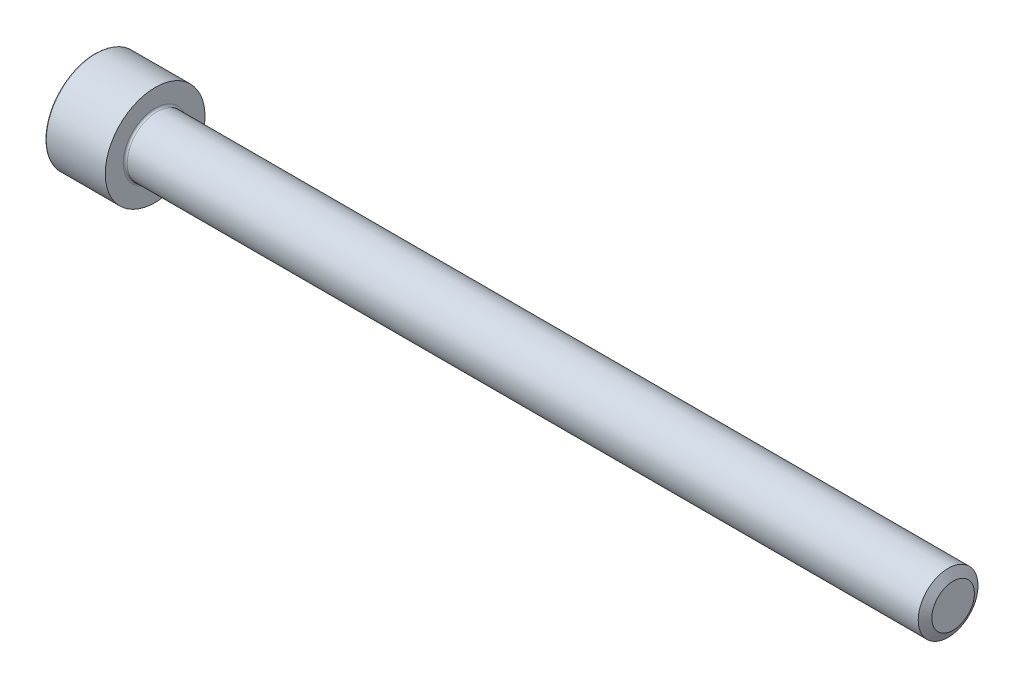
ISO-10303-21;
HEADER;
FILE_DESCRIPTION(('STEP AP214'),'2;1');
FILE_NAME('part.step','',(''),(''),'','','');
FILE_SCHEMA(('AUTOMOTIVE_DESIGN { 1 0 10303 214 1 1 1 1 }'));
ENDSEC;
DATA;
#1=APPLICATION_CONTEXT('core data for automotive mechanical design processes');
#2=APPLICATION_PROTOCOL_DEFINITION('international standard','automotive_design',2000,#1);
#3=PRODUCT_CONTEXT('',#1,'mechanical');
#4=PRODUCT('Part','Part','',(#3));
#5=PRODUCT_RELATED_PRODUCT_CATEGORY('part','',(#4));
#6=PRODUCT_DEFINITION_FORMATION('','',#4);
#7=PRODUCT_DEFINITION_CONTEXT('part definition',#1,'design');
#8=PRODUCT_DEFINITION('design','',#6,#7);
#9=PRODUCT_DEFINITION_SHAPE('','',#8);
#10=(LENGTH_UNIT() NAMED_UNIT(*) SI_UNIT(.MILLI.,.METRE.));
#11=(NAMED_UNIT(*) PLANE_ANGLE_UNIT() SI_UNIT($,.RADIAN.));
#12=(NAMED_UNIT(*) SI_UNIT($,.STERADIAN.) SOLID_ANGLE_UNIT());
#13=UNCERTAINTY_MEASURE_WITH_UNIT(LENGTH_MEASURE(1.E-05),#10,'distance_accuracy_value','');
#14=(GEOMETRIC_REPRESENTATION_CONTEXT(3) GLOBAL_UNCERTAINTY_ASSIGNED_CONTEXT((#13)) GLOBAL_UNIT_ASSIGNED_CONTEXT((#10,
#11,#12)) REPRESENTATION_CONTEXT('',''));
#15=CARTESIAN_POINT('',(0.,0.,0.));
#16=DIRECTION('',(0.,0.,1.));
#17=DIRECTION('',(1.,0.,0.));
#18=AXIS2_PLACEMENT_3D('',#15,#16,#17);
#19=CARTESIAN_POINT('',(0.,0.,0.));
#20=DIRECTION('',(-1.,0.,0.));
#21=DIRECTION('',(0.,0.,1.));
#22=AXIS2_PLACEMENT_3D('',#19,#20,#21);
#23=CYLINDRICAL_SURFACE('',#22,3.);
#24=CARTESIAN_POINT('',(6.2,0.,0.));
#25=DIRECTION('',(-1.,0.,0.));
#26=DIRECTION('',(0.,0.,1.));
#27=AXIS2_PLACEMENT_3D('',#24,#25,#26);
#28=CIRCLE('',#27,3.);
#29=CARTESIAN_POINT('',(6.2,0.,3.));
#30=VERTEX_POINT('',#29);
#31=EDGE_CURVE('E143',#30,#30,#28,.T.);
#32=ORIENTED_EDGE('',*,*,#31,.F.);
#33=EDGE_LOOP('',(#32));
#34=FACE_BOUND('',#33,.T.);
#35=CARTESIAN_POINT('',(85.5000146668818,0.,0.));
#36=DIRECTION('',(-1.,0.,0.));
#37=DIRECTION('',(0.,0.,1.));
#38=AXIS2_PLACEMENT_3D('',#35,#36,#37);
#39=CIRCLE('',#38,3.);
#40=CARTESIAN_POINT('',(85.5000146668818,0.,3.));
#41=VERTEX_POINT('',#40);
#42=EDGE_CURVE('E280',#41,#41,#39,.T.);
#43=ORIENTED_EDGE('',*,*,#42,.T.);
#44=EDGE_LOOP('',(#43));
#45=FACE_BOUND('',#44,.T.);
#46=ADVANCED_FACE('F40',(#34,#45),#23,.T.);
#47=CARTESIAN_POINT('',(0.,0.,0.));
#48=DIRECTION('',(1.,0.,0.));
#49=DIRECTION('',(0.,0.,-1.));
#50=AXIS2_PLACEMENT_3D('',#47,#48,#49);
#51=PLANE('',#50);
#52=CARTESIAN_POINT('',(0.,0.,0.));
#53=DIRECTION('',(1.,0.,0.));
#54=DIRECTION('',(0.,0.,-1.));
#55=AXIS2_PLACEMENT_3D('',#52,#53,#54);
#56=CIRCLE('',#55,4.9);
#57=CARTESIAN_POINT('',(0.,0.,-4.9));
#58=VERTEX_POINT('',#57);
#59=EDGE_CURVE('E48',#58,#58,#56,.F.);
#60=ORIENTED_EDGE('',*,*,#59,.T.);
#61=EDGE_LOOP('',(#60));
#62=FACE_BOUND('',#61,.T.);
#63=DIRECTION('',(0.,0.866025403784439,-0.5));
#64=VECTOR('',#63,1.);
#65=CARTESIAN_POINT('',(0.,0.,2.86));
#66=LINE('',#65,#64);
#67=CARTESIAN_POINT('',(0.,0.,2.86));
#68=VERTEX_POINT('',#67);
#69=CARTESIAN_POINT('',(0.,2.47683265482349,1.43));
#70=VERTEX_POINT('',#69);
#71=EDGE_CURVE('E129',#68,#70,#66,.T.);
#72=ORIENTED_EDGE('',*,*,#71,.F.);
#73=DIRECTION('',(0.,0.866025403784439,0.5));
#74=VECTOR('',#73,1.);
#75=CARTESIAN_POINT('',(0.,-2.47683265482349,1.43));
#76=LINE('',#75,#74);
#77=CARTESIAN_POINT('',(0.,-2.47683265482349,1.43));
#78=VERTEX_POINT('',#77);
#79=EDGE_CURVE('E55',#78,#68,#76,.T.);
#80=ORIENTED_EDGE('',*,*,#79,.F.);
#81=DIRECTION('',(0.,0.,1.));
#82=VECTOR('',#81,1.);
#83=CARTESIAN_POINT('',(0.,-2.47683265482349,-1.43));
#84=LINE('',#83,#82);
#85=CARTESIAN_POINT('',(0.,-2.47683265482349,-1.43));
#86=VERTEX_POINT('',#85);
#87=EDGE_CURVE('E139',#86,#78,#84,.T.);
#88=ORIENTED_EDGE('',*,*,#87,.F.);
#89=DIRECTION('',(0.,-0.866025403784439,0.5));
#90=VECTOR('',#89,1.);
#91=CARTESIAN_POINT('',(0.,0.,-2.86));
#92=LINE('',#91,#90);
#93=CARTESIAN_POINT('',(0.,0.,-2.86));
#94=VERTEX_POINT('',#93);
#95=EDGE_CURVE('E137',#94,#86,#92,.T.);
#96=ORIENTED_EDGE('',*,*,#95,.F.);
#97=DIRECTION('',(0.,-0.866025403784439,-0.5));
#98=VECTOR('',#97,1.);
#99=CARTESIAN_POINT('',(0.,2.47683265482349,-1.43));
#100=LINE('',#99,#98);
#101=CARTESIAN_POINT('',(0.,2.47683265482349,-1.43));
#102=VERTEX_POINT('',#101);
#103=EDGE_CURVE('E103',#102,#94,#100,.T.);
#104=ORIENTED_EDGE('',*,*,#103,.F.);
#105=DIRECTION('',(0.,0.,-1.));
#106=VECTOR('',#105,1.);
#107=CARTESIAN_POINT('',(0.,2.47683265482349,1.43));
#108=LINE('',#107,#106);
#109=EDGE_CURVE('E133',#70,#102,#108,.T.);
#110=ORIENTED_EDGE('',*,*,#109,.F.);
#111=EDGE_LOOP('',(#72,#80,#88,#96,#104,#110));
#112=FACE_BOUND('',#111,.T.);
#113=ADVANCED_FACE('F160',(#62,#112),#51,.F.);
#114=CARTESIAN_POINT('',(0.,0.,0.));
#115=DIRECTION('',(-1.,0.,0.));
#116=DIRECTION('',(0.,0.,1.));
#117=AXIS2_PLACEMENT_3D('',#114,#115,#116);
#118=CYLINDRICAL_SURFACE('',#117,5.);
#119=CARTESIAN_POINT('',(0.1,0.,0.));
#120=DIRECTION('',(1.,0.,0.));
#121=DIRECTION('',(0.,0.,-1.));
#122=AXIS2_PLACEMENT_3D('',#119,#120,#121);
#123=CIRCLE('',#122,5.);
#124=CARTESIAN_POINT('',(0.1,0.,-5.));
#125=VERTEX_POINT('',#124);
#126=EDGE_CURVE('E11',#125,#125,#123,.T.);
#127=ORIENTED_EDGE('',*,*,#126,.T.);
#128=EDGE_LOOP('',(#127));
#129=FACE_BOUND('',#128,.T.);
#130=CARTESIAN_POINT('',(6.,0.,0.));
#131=DIRECTION('',(-1.,0.,0.));
#132=DIRECTION('',(0.,0.,1.));
#133=AXIS2_PLACEMENT_3D('',#130,#131,#132);
#134=CIRCLE('',#133,5.);
#135=CARTESIAN_POINT('',(6.,0.,5.));
#136=VERTEX_POINT('',#135);
#137=EDGE_CURVE('E154',#136,#136,#134,.T.);
#138=ORIENTED_EDGE('',*,*,#137,.T.);
#139=EDGE_LOOP('',(#138));
#140=FACE_BOUND('',#139,.T.);
#141=ADVANCED_FACE('F179',(#129,#140),#118,.T.);
#142=CARTESIAN_POINT('',(6.,5.,0.));
#143=DIRECTION('',(-1.,0.,0.));
#144=DIRECTION('',(0.,0.,1.));
#145=AXIS2_PLACEMENT_3D('',#142,#143,#144);
#146=PLANE('',#145);
#147=ORIENTED_EDGE('',*,*,#137,.F.);
#148=EDGE_LOOP('',(#147));
#149=FACE_BOUND('',#148,.T.);
#150=CARTESIAN_POINT('',(6.,0.,0.));
#151=DIRECTION('',(-1.,0.,0.));
#152=DIRECTION('',(0.,0.,1.));
#153=AXIS2_PLACEMENT_3D('',#150,#151,#152);
#154=CIRCLE('',#153,3.2);
#155=CARTESIAN_POINT('',(6.,0.,3.2));
#156=VERTEX_POINT('',#155);
#157=EDGE_CURVE('E151',#156,#156,#154,.T.);
#158=ORIENTED_EDGE('',*,*,#157,.T.);
#159=EDGE_LOOP('',(#158));
#160=FACE_BOUND('',#159,.T.);
#161=ADVANCED_FACE('F188',(#149,#160),#146,.F.);
#162=CARTESIAN_POINT('',(6.2,0.,0.));
#163=DIRECTION('',(-1.,0.,0.));
#164=DIRECTION('',(0.,0.,1.));
#165=AXIS2_PLACEMENT_3D('',#162,#163,#164);
#166=TOROIDAL_SURFACE('',#165,3.2,0.2);
#167=ORIENTED_EDGE('',*,*,#157,.F.);
#168=EDGE_LOOP('',(#167));
#169=FACE_BOUND('',#168,.T.);
#170=ORIENTED_EDGE('',*,*,#31,.T.);
#171=EDGE_LOOP('',(#170));
#172=FACE_BOUND('',#171,.T.);
#173=ADVANCED_FACE('F184',(#169,#172),#166,.F.);
#174=CARTESIAN_POINT('',(3.,-2.47683265482349,1.43));
#175=DIRECTION('',(0.,-0.5,0.866025403784439));
#176=DIRECTION('',(0.,-0.866025403784439,-0.5));
#177=AXIS2_PLACEMENT_3D('',#174,#175,#176);
#178=PLANE('',#177);
#179=ORIENTED_EDGE('',*,*,#79,.T.);
#180=DIRECTION('',(-1.,0.,0.));
#181=VECTOR('',#180,1.);
#182=CARTESIAN_POINT('',(3.,0.,2.86));
#183=LINE('',#182,#181);
#184=CARTESIAN_POINT('',(3.,0.,2.86));
#185=VERTEX_POINT('',#184);
#186=EDGE_CURVE('E85',#185,#68,#183,.T.);
#187=ORIENTED_EDGE('',*,*,#186,.F.);
#188=DIRECTION('',(0.,0.866025403784439,0.5));
#189=VECTOR('',#188,1.);
#190=CARTESIAN_POINT('',(3.,-2.47683265482349,1.43));
#191=LINE('',#190,#189);
#192=CARTESIAN_POINT('',(3.,-2.47683265482349,1.43));
#193=VERTEX_POINT('',#192);
#194=EDGE_CURVE('E141',#193,#185,#191,.T.);
#195=ORIENTED_EDGE('',*,*,#194,.F.);
#196=DIRECTION('',(-1.,0.,0.));
#197=VECTOR('',#196,1.);
#198=CARTESIAN_POINT('',(3.,-2.47683265482349,1.43));
#199=LINE('',#198,#197);
#200=EDGE_CURVE('E63',#193,#78,#199,.T.);
#201=ORIENTED_EDGE('',*,*,#200,.T.);
#202=EDGE_LOOP('',(#179,#187,#195,#201));
#203=FACE_BOUND('',#202,.T.);
#204=ADVANCED_FACE('F187',(#203),#178,.F.);
#205=CARTESIAN_POINT('',(3.,-2.47683265482349,-1.43));
#206=DIRECTION('',(0.,-1.,0.));
#207=DIRECTION('',(0.,0.,-1.));
#208=AXIS2_PLACEMENT_3D('',#205,#206,#207);
#209=PLANE('',#208);
#210=ORIENTED_EDGE('',*,*,#87,.T.);
#211=ORIENTED_EDGE('',*,*,#200,.F.);
#212=DIRECTION('',(0.,0.,1.));
#213=VECTOR('',#212,1.);
#214=CARTESIAN_POINT('',(3.,-2.47683265482349,-1.43));
#215=LINE('',#214,#213);
#216=CARTESIAN_POINT('',(3.,-2.47683265482349,-1.43));
#217=VERTEX_POINT('',#216);
#218=EDGE_CURVE('E115',#217,#193,#215,.T.);
#219=ORIENTED_EDGE('',*,*,#218,.F.);
#220=DIRECTION('',(-1.,0.,0.));
#221=VECTOR('',#220,1.);
#222=CARTESIAN_POINT('',(3.,-2.47683265482349,-1.43));
#223=LINE('',#222,#221);
#224=EDGE_CURVE('E107',#217,#86,#223,.T.);
#225=ORIENTED_EDGE('',*,*,#224,.T.);
#226=EDGE_LOOP('',(#210,#211,#219,#225));
#227=FACE_BOUND('',#226,.T.);
#228=ADVANCED_FACE('F218',(#227),#209,.F.);
#229=CARTESIAN_POINT('',(3.,0.,-2.86));
#230=DIRECTION('',(0.,-0.5,-0.866025403784438));
#231=DIRECTION('',(0.,0.866025403784439,-0.5));
#232=AXIS2_PLACEMENT_3D('',#229,#230,#231);
#233=PLANE('',#232);
#234=ORIENTED_EDGE('',*,*,#95,.T.);
#235=ORIENTED_EDGE('',*,*,#224,.F.);
#236=DIRECTION('',(0.,-0.866025403784439,0.5));
#237=VECTOR('',#236,1.);
#238=CARTESIAN_POINT('',(3.,0.,-2.86));
#239=LINE('',#238,#237);
#240=CARTESIAN_POINT('',(3.,0.,-2.86));
#241=VERTEX_POINT('',#240);
#242=EDGE_CURVE('E111',#241,#217,#239,.T.);
#243=ORIENTED_EDGE('',*,*,#242,.F.);
#244=DIRECTION('',(-1.,0.,0.));
#245=VECTOR('',#244,1.);
#246=CARTESIAN_POINT('',(3.,0.,-2.86));
#247=LINE('',#246,#245);
#248=EDGE_CURVE('E96',#241,#94,#247,.T.);
#249=ORIENTED_EDGE('',*,*,#248,.T.);
#250=EDGE_LOOP('',(#234,#235,#243,#249));
#251=FACE_BOUND('',#250,.T.);
#252=ADVANCED_FACE('F112',(#251),#233,.F.);
#253=CARTESIAN_POINT('',(3.,2.47683265482349,-1.43));
#254=DIRECTION('',(0.,0.5,-0.866025403784439));
#255=DIRECTION('',(0.,0.866025403784439,0.5));
#256=AXIS2_PLACEMENT_3D('',#253,#254,#255);
#257=PLANE('',#256);
#258=ORIENTED_EDGE('',*,*,#103,.T.);
#259=ORIENTED_EDGE('',*,*,#248,.F.);
#260=DIRECTION('',(0.,-0.866025403784439,-0.5));
#261=VECTOR('',#260,1.);
#262=CARTESIAN_POINT('',(3.,2.47683265482349,-1.43));
#263=LINE('',#262,#261);
#264=CARTESIAN_POINT('',(3.,2.47683265482349,-1.43));
#265=VERTEX_POINT('',#264);
#266=EDGE_CURVE('E100',#265,#241,#263,.T.);
#267=ORIENTED_EDGE('',*,*,#266,.F.);
#268=DIRECTION('',(-1.,0.,0.));
#269=VECTOR('',#268,1.);
#270=CARTESIAN_POINT('',(3.,2.47683265482349,-1.43));
#271=LINE('',#270,#269);
#272=EDGE_CURVE('E108',#265,#102,#271,.T.);
#273=ORIENTED_EDGE('',*,*,#272,.T.);
#274=EDGE_LOOP('',(#258,#259,#267,#273));
#275=FACE_BOUND('',#274,.T.);
#276=ADVANCED_FACE('F98',(#275),#257,.F.);
#277=CARTESIAN_POINT('',(3.,2.47683265482349,1.43));
#278=DIRECTION('',(0.,1.,0.));
#279=DIRECTION('',(0.,0.,1.));
#280=AXIS2_PLACEMENT_3D('',#277,#278,#279);
#281=PLANE('',#280);
#282=ORIENTED_EDGE('',*,*,#109,.T.);
#283=ORIENTED_EDGE('',*,*,#272,.F.);
#284=DIRECTION('',(0.,0.,-1.));
#285=VECTOR('',#284,1.);
#286=CARTESIAN_POINT('',(3.,2.47683265482349,1.43));
#287=LINE('',#286,#285);
#288=CARTESIAN_POINT('',(3.,2.47683265482349,1.43));
#289=VERTEX_POINT('',#288);
#290=EDGE_CURVE('E121',#289,#265,#287,.T.);
#291=ORIENTED_EDGE('',*,*,#290,.F.);
#292=DIRECTION('',(-1.,0.,0.));
#293=VECTOR('',#292,1.);
#294=CARTESIAN_POINT('',(3.,2.47683265482349,1.43));
#295=LINE('',#294,#293);
#296=EDGE_CURVE('E146',#289,#70,#295,.T.);
#297=ORIENTED_EDGE('',*,*,#296,.T.);
#298=EDGE_LOOP('',(#282,#283,#291,#297));
#299=FACE_BOUND('',#298,.T.);
#300=ADVANCED_FACE('F236',(#299),#281,.F.);
#301=CARTESIAN_POINT('',(3.,0.,2.86));
#302=DIRECTION('',(0.,0.5,0.866025403784438));
#303=DIRECTION('',(0.,-0.866025403784439,0.5));
#304=AXIS2_PLACEMENT_3D('',#301,#302,#303);
#305=PLANE('',#304);
#306=ORIENTED_EDGE('',*,*,#71,.T.);
#307=ORIENTED_EDGE('',*,*,#296,.F.);
#308=DIRECTION('',(0.,0.866025403784439,-0.5));
#309=VECTOR('',#308,1.);
#310=CARTESIAN_POINT('',(3.,0.,2.86));
#311=LINE('',#310,#309);
#312=EDGE_CURVE('E123',#185,#289,#311,.T.);
#313=ORIENTED_EDGE('',*,*,#312,.F.);
#314=ORIENTED_EDGE('',*,*,#186,.T.);
#315=EDGE_LOOP('',(#306,#307,#313,#314));
#316=FACE_BOUND('',#315,.T.);
#317=ADVANCED_FACE('F243',(#316),#305,.F.);
#318=CARTESIAN_POINT('',(3.,-2.47683265482349,1.43));
#319=DIRECTION('',(1.,0.,0.));
#320=DIRECTION('',(0.,0.,-1.));
#321=AXIS2_PLACEMENT_3D('',#318,#319,#320);
#322=PLANE('',#321);
#323=ORIENTED_EDGE('',*,*,#194,.T.);
#324=ORIENTED_EDGE('',*,*,#312,.T.);
#325=ORIENTED_EDGE('',*,*,#290,.T.);
#326=ORIENTED_EDGE('',*,*,#266,.T.);
#327=ORIENTED_EDGE('',*,*,#242,.T.);
#328=ORIENTED_EDGE('',*,*,#218,.T.);
#329=EDGE_LOOP('',(#323,#324,#325,#326,#327,#328));
#330=FACE_BOUND('',#329,.T.);
#331=ADVANCED_FACE('F118',(#330),#322,.F.);
#332=CARTESIAN_POINT('',(85.5000146668818,0.,0.));
#333=DIRECTION('',(-1.,0.,0.));
#334=DIRECTION('',(0.,0.,1.));
#335=AXIS2_PLACEMENT_3D('',#332,#333,#334);
#336=CONICAL_SURFACE('',#335,3.,1.04719755119659);
#337=CARTESIAN_POINT('',(86.,0.,0.));
#338=DIRECTION('',(-1.,0.,0.));
#339=DIRECTION('',(0.,0.,1.));
#340=AXIS2_PLACEMENT_3D('',#337,#338,#339);
#341=CIRCLE('',#340,2.134);
#342=CARTESIAN_POINT('',(86.,0.,2.134));
#343=VERTEX_POINT('',#342);
#344=EDGE_CURVE('E130',#343,#343,#341,.T.);
#345=ORIENTED_EDGE('',*,*,#344,.T.);
#346=EDGE_LOOP('',(#345));
#347=FACE_BOUND('',#346,.T.);
#348=ORIENTED_EDGE('',*,*,#42,.F.);
#349=EDGE_LOOP('',(#348));
#350=FACE_BOUND('',#349,.T.);
#351=ADVANCED_FACE('F169',(#347,#350),#336,.T.);
#352=CARTESIAN_POINT('',(86.,3.,0.));
#353=DIRECTION('',(-1.,0.,0.));
#354=DIRECTION('',(0.,0.,1.));
#355=AXIS2_PLACEMENT_3D('',#352,#353,#354);
#356=PLANE('',#355);
#357=ORIENTED_EDGE('',*,*,#344,.F.);
#358=EDGE_LOOP('',(#357));
#359=FACE_BOUND('',#358,.T.);
#360=ADVANCED_FACE('F164',(#359),#356,.F.);
#361=CARTESIAN_POINT('',(0.1,0.,0.));
#362=DIRECTION('',(1.,0.,0.));
#363=DIRECTION('',(0.,0.,-1.));
#364=AXIS2_PLACEMENT_3D('',#361,#362,#363);
#365=TOROIDAL_SURFACE('',#364,4.9,0.1);
#366=ORIENTED_EDGE('',*,*,#126,.F.);
#367=EDGE_LOOP('',(#366));
#368=FACE_BOUND('',#367,.T.);
#369=ORIENTED_EDGE('',*,*,#59,.F.);
#370=EDGE_LOOP('',(#369));
#371=FACE_BOUND('',#370,.T.);
#372=ADVANCED_FACE('F42',(#368,#371),#365,.T.);
#373=CLOSED_SHELL('',(#46,#113,#141,#161,#173,#204,#228,#252,#276,#300,#317,#331,#351,#360,#372));
#374=MANIFOLD_SOLID_BREP('B2',#373);
#375=ADVANCED_BREP_SHAPE_REPRESENTATION('',(#18,#374),#14);
#376=SHAPE_DEFINITION_REPRESENTATION(#9,#375);
ENDSEC;
END-ISO-10303-21;
